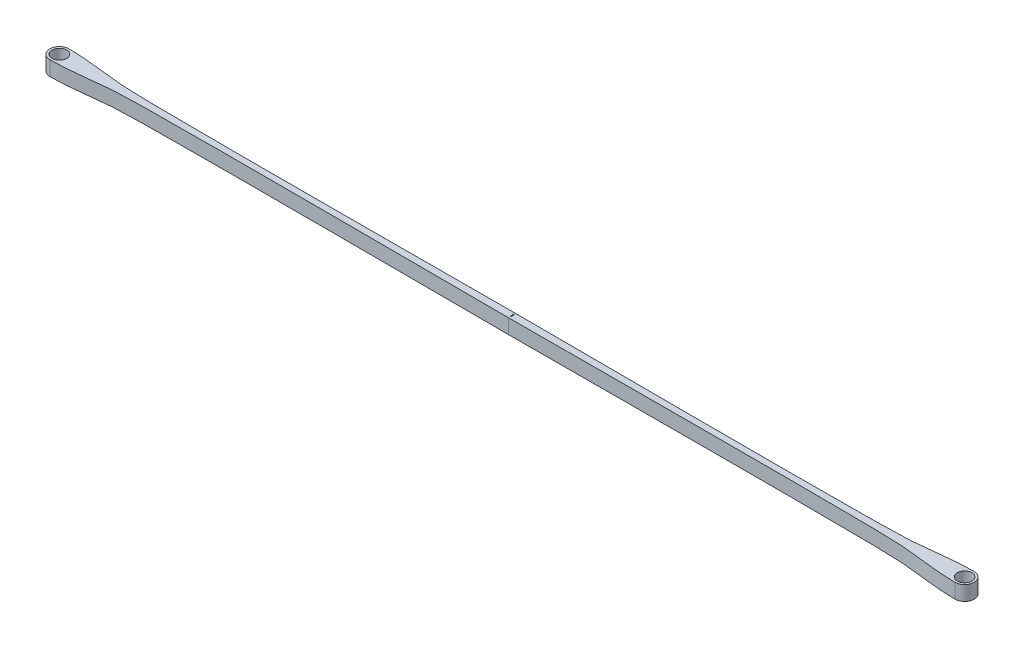
ISO-10303-21;
HEADER;
FILE_DESCRIPTION(('STEP AP214'),'2;1');
FILE_NAME('part.step','',(''),(''),'','','');
FILE_SCHEMA(('AUTOMOTIVE_DESIGN { 1 0 10303 214 1 1 1 1 }'));
ENDSEC;
DATA;
#1=APPLICATION_CONTEXT('core data for automotive mechanical design processes');
#2=APPLICATION_PROTOCOL_DEFINITION('international standard','automotive_design',2000,#1);
#3=PRODUCT_CONTEXT('',#1,'mechanical');
#4=PRODUCT('Part','Part','',(#3));
#5=PRODUCT_RELATED_PRODUCT_CATEGORY('part','',(#4));
#6=PRODUCT_DEFINITION_FORMATION('','',#4);
#7=PRODUCT_DEFINITION_CONTEXT('part definition',#1,'design');
#8=PRODUCT_DEFINITION('design','',#6,#7);
#9=PRODUCT_DEFINITION_SHAPE('','',#8);
#10=(LENGTH_UNIT() NAMED_UNIT(*) SI_UNIT(.MILLI.,.METRE.));
#11=(NAMED_UNIT(*) PLANE_ANGLE_UNIT() SI_UNIT($,.RADIAN.));
#12=(NAMED_UNIT(*) SI_UNIT($,.STERADIAN.) SOLID_ANGLE_UNIT());
#13=UNCERTAINTY_MEASURE_WITH_UNIT(LENGTH_MEASURE(1.E-05),#10,'distance_accuracy_value','');
#14=(GEOMETRIC_REPRESENTATION_CONTEXT(3) GLOBAL_UNCERTAINTY_ASSIGNED_CONTEXT((#13)) GLOBAL_UNIT_ASSIGNED_CONTEXT((#10,
#11,#12)) REPRESENTATION_CONTEXT('',''));
#15=CARTESIAN_POINT('',(0.,0.,0.));
#16=DIRECTION('',(0.,0.,1.));
#17=DIRECTION('',(1.,0.,0.));
#18=AXIS2_PLACEMENT_3D('',#15,#16,#17);
#19=CARTESIAN_POINT('',(0.,2.,1.30000507237961));
#20=CARTESIAN_POINT('',(2.1582956686711,2.,1.30000507237961));
#21=CARTESIAN_POINT('',(7.60592517311194,2.,0.548342251474103));
#22=CARTESIAN_POINT('',(11.061575129074,2.,0.324012224077829));
#23=CARTESIAN_POINT('',(61.9,2.,0.5));
#24=B_SPLINE_CURVE_WITH_KNOTS('',3,(#19,#20,#21,#22,#23),.UNSPECIFIED.,.F.,.F.,(4,1,4),(0.,
0.427834461323006,1.),.UNSPECIFIED.);
#25=DIRECTION('',(0.,-1.,0.));
#26=VECTOR('',#25,1.);
#27=SURFACE_OF_LINEAR_EXTRUSION('',#24,#26);
#28=CARTESIAN_POINT('',(0.,0.,1.30000507237961));
#29=CARTESIAN_POINT('',(2.1582956686711,0.,1.30000507237961));
#30=CARTESIAN_POINT('',(7.60592517311194,0.,0.548342251474103));
#31=CARTESIAN_POINT('',(11.061575129074,0.,0.324012224077829));
#32=CARTESIAN_POINT('',(61.9,0.,0.5));
#33=B_SPLINE_CURVE_WITH_KNOTS('',3,(#28,#29,#30,#31,#32),.UNSPECIFIED.,.F.,.F.,(4,1,4),(0.,
0.427834461323006,1.),.UNSPECIFIED.);
#34=CARTESIAN_POINT('',(0.,0.,1.30000507237961));
#35=VERTEX_POINT('',#34);
#36=CARTESIAN_POINT('',(61.9,0.,0.5));
#37=VERTEX_POINT('',#36);
#38=EDGE_CURVE('E292',#35,#37,#33,.T.);
#39=ORIENTED_EDGE('',*,*,#38,.T.);
#40=DIRECTION('',(0.,-1.,0.));
#41=VECTOR('',#40,1.);
#42=CARTESIAN_POINT('',(61.9,2.,0.5));
#43=LINE('',#42,#41);
#44=CARTESIAN_POINT('',(61.9,2.,0.5));
#45=VERTEX_POINT('',#44);
#46=EDGE_CURVE('E101',#45,#37,#43,.T.);
#47=ORIENTED_EDGE('',*,*,#46,.F.);
#48=CARTESIAN_POINT('',(0.,2.,1.30000507237961));
#49=VERTEX_POINT('',#48);
#50=EDGE_CURVE('E287',#49,#45,#24,.T.);
#51=ORIENTED_EDGE('',*,*,#50,.F.);
#52=DIRECTION('',(0.,-1.,0.));
#53=VECTOR('',#52,1.);
#54=CARTESIAN_POINT('',(0.,2.,1.30000507237961));
#55=LINE('',#54,#53);
#56=EDGE_CURVE('E12',#49,#35,#55,.T.);
#57=ORIENTED_EDGE('',*,*,#56,.T.);
#58=EDGE_LOOP('',(#39,#47,#51,#57));
#59=FACE_BOUND('',#58,.T.);
#60=ADVANCED_FACE('F91',(#59),#27,.F.);
#61=CARTESIAN_POINT('',(0.,2.,-1.30000507237961));
#62=CARTESIAN_POINT('',(2.1582956686711,2.,-1.30000507237961));
#63=CARTESIAN_POINT('',(7.60592517311194,2.,-0.548342251474103));
#64=CARTESIAN_POINT('',(11.061575129074,2.,-0.324012224077829));
#65=CARTESIAN_POINT('',(61.9,2.,-0.5));
#66=B_SPLINE_CURVE_WITH_KNOTS('',3,(#61,#62,#63,#64,#65),.UNSPECIFIED.,.F.,.F.,(4,1,4),(0.,
0.427834461323006,1.),.UNSPECIFIED.);
#67=DIRECTION('',(0.,-1.,0.));
#68=VECTOR('',#67,1.);
#69=SURFACE_OF_LINEAR_EXTRUSION('',#66,#68);
#70=CARTESIAN_POINT('',(0.,0.,-1.30000507237961));
#71=CARTESIAN_POINT('',(2.1582956686711,0.,-1.30000507237961));
#72=CARTESIAN_POINT('',(7.60592517311194,0.,-0.548342251474103));
#73=CARTESIAN_POINT('',(11.061575129074,0.,-0.324012224077829));
#74=CARTESIAN_POINT('',(61.9,0.,-0.5));
#75=B_SPLINE_CURVE_WITH_KNOTS('',3,(#70,#71,#72,#73,#74),.UNSPECIFIED.,.F.,.F.,(4,1,4),(0.,
0.427834461323006,1.),.UNSPECIFIED.);
#76=CARTESIAN_POINT('',(0.,0.,-1.30000507237961));
#77=VERTEX_POINT('',#76);
#78=CARTESIAN_POINT('',(61.9,0.,-0.5));
#79=VERTEX_POINT('',#78);
#80=EDGE_CURVE('E300',#77,#79,#75,.T.);
#81=ORIENTED_EDGE('',*,*,#80,.F.);
#82=DIRECTION('',(0.,-1.,0.));
#83=VECTOR('',#82,1.);
#84=CARTESIAN_POINT('',(0.,2.,-1.30000507237961));
#85=LINE('',#84,#83);
#86=CARTESIAN_POINT('',(0.,2.,-1.30000507237961));
#87=VERTEX_POINT('',#86);
#88=EDGE_CURVE('E118',#87,#77,#85,.T.);
#89=ORIENTED_EDGE('',*,*,#88,.F.);
#90=CARTESIAN_POINT('',(61.9,2.,-0.5));
#91=VERTEX_POINT('',#90);
#92=EDGE_CURVE('E281',#87,#91,#66,.T.);
#93=ORIENTED_EDGE('',*,*,#92,.T.);
#94=DIRECTION('',(0.,-1.,0.));
#95=VECTOR('',#94,1.);
#96=CARTESIAN_POINT('',(61.9,2.,-0.5));
#97=LINE('',#96,#95);
#98=EDGE_CURVE('E315',#91,#79,#97,.T.);
#99=ORIENTED_EDGE('',*,*,#98,.T.);
#100=EDGE_LOOP('',(#81,#89,#93,#99));
#101=FACE_BOUND('',#100,.T.);
#102=ADVANCED_FACE('F276',(#101),#69,.T.);
#103=CARTESIAN_POINT('',(0.,0.,0.));
#104=DIRECTION('',(0.,1.,0.));
#105=DIRECTION('',(0.,0.,1.));
#106=AXIS2_PLACEMENT_3D('',#103,#104,#105);
#107=PLANE('',#106);
#108=CARTESIAN_POINT('',(123.8,0.,0.));
#109=DIRECTION('',(0.,-1.,0.));
#110=DIRECTION('',(0.,0.,1.));
#111=AXIS2_PLACEMENT_3D('',#108,#109,#110);
#112=CIRCLE('',#111,1.);
#113=CARTESIAN_POINT('',(123.8,0.,1.));
#114=VERTEX_POINT('',#113);
#115=EDGE_CURVE('E225',#114,#114,#112,.T.);
#116=ORIENTED_EDGE('',*,*,#115,.F.);
#117=EDGE_LOOP('',(#116));
#118=FACE_BOUND('',#117,.T.);
#119=CARTESIAN_POINT('',(0.,0.,0.));
#120=DIRECTION('',(0.,1.,0.));
#121=DIRECTION('',(0.,0.,1.));
#122=AXIS2_PLACEMENT_3D('',#119,#120,#121);
#123=CIRCLE('',#122,1.);
#124=CARTESIAN_POINT('',(0.,0.,1.));
#125=VERTEX_POINT('',#124);
#126=EDGE_CURVE('E325',#125,#125,#123,.T.);
#127=ORIENTED_EDGE('',*,*,#126,.T.);
#128=EDGE_LOOP('',(#127));
#129=FACE_BOUND('',#128,.T.);
#130=ORIENTED_EDGE('',*,*,#38,.F.);
#131=CARTESIAN_POINT('',(0.,0.,0.));
#132=DIRECTION('',(0.,1.,0.));
#133=DIRECTION('',(0.,0.,1.));
#134=AXIS2_PLACEMENT_3D('',#131,#132,#133);
#135=CIRCLE('',#134,1.30000507237961);
#136=EDGE_CURVE('E95',#77,#35,#135,.T.);
#137=ORIENTED_EDGE('',*,*,#136,.F.);
#138=ORIENTED_EDGE('',*,*,#80,.T.);
#139=CARTESIAN_POINT('',(123.8,0.,-1.30000507237961));
#140=CARTESIAN_POINT('',(121.641704331329,0.,-1.30000507237961));
#141=CARTESIAN_POINT('',(116.194074826888,0.,-0.548342251474103));
#142=CARTESIAN_POINT('',(112.738424870926,0.,-0.324012224077829));
#143=CARTESIAN_POINT('',(61.9,0.,-0.5));
#144=B_SPLINE_CURVE_WITH_KNOTS('',3,(#139,#140,#141,#142,#143),.UNSPECIFIED.,.F.,.F.,(4,1,4),
(0.,0.427834461323006,1.),.UNSPECIFIED.);
#145=CARTESIAN_POINT('',(123.8,0.,-1.30000507237961));
#146=VERTEX_POINT('',#145);
#147=EDGE_CURVE('E237',#146,#79,#144,.T.);
#148=ORIENTED_EDGE('',*,*,#147,.F.);
#149=CARTESIAN_POINT('',(123.8,0.,0.));
#150=DIRECTION('',(0.,-1.,0.));
#151=DIRECTION('',(0.,0.,1.));
#152=AXIS2_PLACEMENT_3D('',#149,#150,#151);
#153=CIRCLE('',#152,1.30000507237961);
#154=CARTESIAN_POINT('',(123.8,0.,1.30000507237961));
#155=VERTEX_POINT('',#154);
#156=EDGE_CURVE('E229',#146,#155,#153,.T.);
#157=ORIENTED_EDGE('',*,*,#156,.T.);
#158=CARTESIAN_POINT('',(123.8,0.,1.30000507237961));
#159=CARTESIAN_POINT('',(121.641704331329,0.,1.30000507237961));
#160=CARTESIAN_POINT('',(116.194074826888,0.,0.548342251474103));
#161=CARTESIAN_POINT('',(112.738424870926,0.,0.324012224077829));
#162=CARTESIAN_POINT('',(61.9,0.,0.5));
#163=B_SPLINE_CURVE_WITH_KNOTS('',3,(#158,#159,#160,#161,#162),.UNSPECIFIED.,.F.,.F.,(4,1,4),
(0.,0.427834461323006,1.),.UNSPECIFIED.);
#164=EDGE_CURVE('E249',#155,#37,#163,.T.);
#165=ORIENTED_EDGE('',*,*,#164,.T.);
#166=EDGE_LOOP('',(#130,#137,#138,#148,#157,#165));
#167=FACE_BOUND('',#166,.T.);
#168=ADVANCED_FACE('F272',(#118,#129,#167),#107,.F.);
#169=CARTESIAN_POINT('',(0.,2.,0.));
#170=DIRECTION('',(0.,1.,0.));
#171=DIRECTION('',(0.,0.,1.));
#172=AXIS2_PLACEMENT_3D('',#169,#170,#171);
#173=PLANE('',#172);
#174=DIRECTION('',(0.,0.,1.));
#175=VECTOR('',#174,1.);
#176=CARTESIAN_POINT('',(61.85,2.,0.200005072379613));
#177=LINE('',#176,#175);
#178=CARTESIAN_POINT('',(61.85,2.,-0.299994927620387));
#179=VERTEX_POINT('',#178);
#180=CARTESIAN_POINT('',(61.85,2.,0.200005072379613));
#181=VERTEX_POINT('',#180);
#182=EDGE_CURVE('E109',#179,#181,#177,.T.);
#183=ORIENTED_EDGE('',*,*,#182,.F.);
#184=DIRECTION('',(-1.,0.,0.));
#185=VECTOR('',#184,1.);
#186=CARTESIAN_POINT('',(61.85,2.,-0.299994927620387));
#187=LINE('',#186,#185);
#188=CARTESIAN_POINT('',(61.95,2.,-0.299994927620387));
#189=VERTEX_POINT('',#188);
#190=EDGE_CURVE('E197',#189,#179,#187,.T.);
#191=ORIENTED_EDGE('',*,*,#190,.F.);
#192=DIRECTION('',(0.,0.,-1.));
#193=VECTOR('',#192,1.);
#194=CARTESIAN_POINT('',(61.95,2.,0.200005072379613));
#195=LINE('',#194,#193);
#196=CARTESIAN_POINT('',(61.95,2.,0.200005072379613));
#197=VERTEX_POINT('',#196);
#198=EDGE_CURVE('E201',#197,#189,#195,.T.);
#199=ORIENTED_EDGE('',*,*,#198,.F.);
#200=DIRECTION('',(1.,0.,0.));
#201=VECTOR('',#200,1.);
#202=CARTESIAN_POINT('',(61.85,2.,0.200005072379613));
#203=LINE('',#202,#201);
#204=EDGE_CURVE('E210',#181,#197,#203,.T.);
#205=ORIENTED_EDGE('',*,*,#204,.F.);
#206=EDGE_LOOP('',(#183,#191,#199,#205));
#207=FACE_BOUND('',#206,.T.);
#208=CARTESIAN_POINT('',(123.8,2.,0.));
#209=DIRECTION('',(0.,-1.,0.));
#210=DIRECTION('',(0.,0.,1.));
#211=AXIS2_PLACEMENT_3D('',#208,#209,#210);
#212=CIRCLE('',#211,1.);
#213=CARTESIAN_POINT('',(123.8,2.,1.));
#214=VERTEX_POINT('',#213);
#215=EDGE_CURVE('E219',#214,#214,#212,.T.);
#216=ORIENTED_EDGE('',*,*,#215,.T.);
#217=EDGE_LOOP('',(#216));
#218=FACE_BOUND('',#217,.T.);
#219=CARTESIAN_POINT('',(0.,2.,0.));
#220=DIRECTION('',(0.,1.,0.));
#221=DIRECTION('',(0.,0.,1.));
#222=AXIS2_PLACEMENT_3D('',#219,#220,#221);
#223=CIRCLE('',#222,1.);
#224=CARTESIAN_POINT('',(0.,2.,1.));
#225=VERTEX_POINT('',#224);
#226=EDGE_CURVE('E329',#225,#225,#223,.T.);
#227=ORIENTED_EDGE('',*,*,#226,.F.);
#228=EDGE_LOOP('',(#227));
#229=FACE_BOUND('',#228,.T.);
#230=ORIENTED_EDGE('',*,*,#92,.F.);
#231=CARTESIAN_POINT('',(0.,2.,0.));
#232=DIRECTION('',(0.,1.,0.));
#233=DIRECTION('',(0.,0.,1.));
#234=AXIS2_PLACEMENT_3D('',#231,#232,#233);
#235=CIRCLE('',#234,1.30000507237961);
#236=EDGE_CURVE('E301',#87,#49,#235,.T.);
#237=ORIENTED_EDGE('',*,*,#236,.T.);
#238=ORIENTED_EDGE('',*,*,#50,.T.);
#239=CARTESIAN_POINT('',(123.8,2.,1.30000507237961));
#240=CARTESIAN_POINT('',(121.641704331329,2.,1.30000507237961));
#241=CARTESIAN_POINT('',(116.194074826888,2.,0.548342251474103));
#242=CARTESIAN_POINT('',(112.738424870926,2.,0.324012224077829));
#243=CARTESIAN_POINT('',(61.9,2.,0.5));
#244=B_SPLINE_CURVE_WITH_KNOTS('',3,(#239,#240,#241,#242,#243),.UNSPECIFIED.,.F.,.F.,(4,1,4),
(0.,0.427834461323006,1.),.UNSPECIFIED.);
#245=CARTESIAN_POINT('',(123.8,2.,1.30000507237961));
#246=VERTEX_POINT('',#245);
#247=EDGE_CURVE('E248',#246,#45,#244,.T.);
#248=ORIENTED_EDGE('',*,*,#247,.F.);
#249=CARTESIAN_POINT('',(123.8,2.,0.));
#250=DIRECTION('',(0.,-1.,0.));
#251=DIRECTION('',(0.,0.,1.));
#252=AXIS2_PLACEMENT_3D('',#249,#250,#251);
#253=CIRCLE('',#252,1.30000507237961);
#254=CARTESIAN_POINT('',(123.8,2.,-1.30000507237961));
#255=VERTEX_POINT('',#254);
#256=EDGE_CURVE('E233',#255,#246,#253,.T.);
#257=ORIENTED_EDGE('',*,*,#256,.F.);
#258=CARTESIAN_POINT('',(123.8,2.,-1.30000507237961));
#259=CARTESIAN_POINT('',(121.641704331329,2.,-1.30000507237961));
#260=CARTESIAN_POINT('',(116.194074826888,2.,-0.548342251474103));
#261=CARTESIAN_POINT('',(112.738424870926,2.,-0.324012224077829));
#262=CARTESIAN_POINT('',(61.9,2.,-0.5));
#263=B_SPLINE_CURVE_WITH_KNOTS('',3,(#258,#259,#260,#261,#262),.UNSPECIFIED.,.F.,.F.,(4,1,4),
(0.,0.427834461323006,1.),.UNSPECIFIED.);
#264=EDGE_CURVE('E241',#255,#91,#263,.T.);
#265=ORIENTED_EDGE('',*,*,#264,.T.);
#266=EDGE_LOOP('',(#230,#237,#238,#248,#257,#265));
#267=FACE_BOUND('',#266,.T.);
#268=ADVANCED_FACE('F269',(#207,#218,#229,#267),#173,.T.);
#269=CARTESIAN_POINT('',(0.,2.,0.));
#270=DIRECTION('',(0.,-1.,0.));
#271=DIRECTION('',(0.,0.,-1.));
#272=AXIS2_PLACEMENT_3D('',#269,#270,#271);
#273=CYLINDRICAL_SURFACE('',#272,1.30000507237961);
#274=ORIENTED_EDGE('',*,*,#56,.F.);
#275=ORIENTED_EDGE('',*,*,#236,.F.);
#276=ORIENTED_EDGE('',*,*,#88,.T.);
#277=ORIENTED_EDGE('',*,*,#136,.T.);
#278=EDGE_LOOP('',(#274,#275,#276,#277));
#279=FACE_BOUND('',#278,.T.);
#280=ADVANCED_FACE('F93',(#279),#273,.T.);
#281=CARTESIAN_POINT('',(0.,0.,0.));
#282=DIRECTION('',(0.,1.,0.));
#283=DIRECTION('',(0.,0.,1.));
#284=AXIS2_PLACEMENT_3D('',#281,#282,#283);
#285=CYLINDRICAL_SURFACE('',#284,1.);
#286=ORIENTED_EDGE('',*,*,#126,.F.);
#287=EDGE_LOOP('',(#286));
#288=FACE_BOUND('',#287,.T.);
#289=ORIENTED_EDGE('',*,*,#226,.T.);
#290=EDGE_LOOP('',(#289));
#291=FACE_BOUND('',#290,.T.);
#292=ADVANCED_FACE('F263',(#288,#291),#285,.F.);
#293=DIRECTION('',(0.,-1.,0.));
#294=VECTOR('',#293,1.);
#295=SURFACE_OF_LINEAR_EXTRUSION('',#263,#294);
#296=ORIENTED_EDGE('',*,*,#147,.T.);
#297=ORIENTED_EDGE('',*,*,#98,.F.);
#298=ORIENTED_EDGE('',*,*,#264,.F.);
#299=DIRECTION('',(0.,-1.,0.));
#300=VECTOR('',#299,1.);
#301=CARTESIAN_POINT('',(123.8,2.,-1.30000507237961));
#302=LINE('',#301,#300);
#303=EDGE_CURVE('E335',#255,#146,#302,.T.);
#304=ORIENTED_EDGE('',*,*,#303,.T.);
#305=EDGE_LOOP('',(#296,#297,#298,#304));
#306=FACE_BOUND('',#305,.T.);
#307=ADVANCED_FACE('F258',(#306),#295,.F.);
#308=DIRECTION('',(0.,-1.,0.));
#309=VECTOR('',#308,1.);
#310=SURFACE_OF_LINEAR_EXTRUSION('',#244,#309);
#311=ORIENTED_EDGE('',*,*,#164,.F.);
#312=DIRECTION('',(0.,-1.,0.));
#313=VECTOR('',#312,1.);
#314=CARTESIAN_POINT('',(123.8,2.,1.30000507237961));
#315=LINE('',#314,#313);
#316=EDGE_CURVE('E339',#246,#155,#315,.T.);
#317=ORIENTED_EDGE('',*,*,#316,.F.);
#318=ORIENTED_EDGE('',*,*,#247,.T.);
#319=ORIENTED_EDGE('',*,*,#46,.T.);
#320=EDGE_LOOP('',(#311,#317,#318,#319));
#321=FACE_BOUND('',#320,.T.);
#322=ADVANCED_FACE('F262',(#321),#310,.T.);
#323=CARTESIAN_POINT('',(123.8,2.,0.));
#324=DIRECTION('',(0.,-1.,0.));
#325=DIRECTION('',(0.,0.,-1.));
#326=AXIS2_PLACEMENT_3D('',#323,#324,#325);
#327=CYLINDRICAL_SURFACE('',#326,1.30000507237961);
#328=ORIENTED_EDGE('',*,*,#303,.F.);
#329=ORIENTED_EDGE('',*,*,#256,.T.);
#330=ORIENTED_EDGE('',*,*,#316,.T.);
#331=ORIENTED_EDGE('',*,*,#156,.F.);
#332=EDGE_LOOP('',(#328,#329,#330,#331));
#333=FACE_BOUND('',#332,.T.);
#334=ADVANCED_FACE('F363',(#333),#327,.T.);
#335=CARTESIAN_POINT('',(123.8,0.,0.));
#336=DIRECTION('',(0.,1.,0.));
#337=DIRECTION('',(0.,0.,1.));
#338=AXIS2_PLACEMENT_3D('',#335,#336,#337);
#339=CYLINDRICAL_SURFACE('',#338,1.);
#340=ORIENTED_EDGE('',*,*,#115,.T.);
#341=EDGE_LOOP('',(#340));
#342=FACE_BOUND('',#341,.T.);
#343=ORIENTED_EDGE('',*,*,#215,.F.);
#344=EDGE_LOOP('',(#343));
#345=FACE_BOUND('',#344,.T.);
#346=ADVANCED_FACE('F413',(#342,#345),#339,.F.);
#347=CARTESIAN_POINT('',(61.85,1.5,0.200005072379613));
#348=DIRECTION('',(-1.,0.,0.));
#349=DIRECTION('',(0.,0.,1.));
#350=AXIS2_PLACEMENT_3D('',#347,#348,#349);
#351=PLANE('',#350);
#352=ORIENTED_EDGE('',*,*,#182,.T.);
#353=DIRECTION('',(0.,1.,0.));
#354=VECTOR('',#353,1.);
#355=CARTESIAN_POINT('',(61.85,1.5,0.200005072379613));
#356=LINE('',#355,#354);
#357=CARTESIAN_POINT('',(61.85,1.5,0.200005072379613));
#358=VERTEX_POINT('',#357);
#359=EDGE_CURVE('E172',#358,#181,#356,.T.);
#360=ORIENTED_EDGE('',*,*,#359,.F.);
#361=DIRECTION('',(0.,0.,1.));
#362=VECTOR('',#361,1.);
#363=CARTESIAN_POINT('',(61.85,1.5,0.200005072379613));
#364=LINE('',#363,#362);
#365=CARTESIAN_POINT('',(61.85,1.5,-0.299994927620387));
#366=VERTEX_POINT('',#365);
#367=EDGE_CURVE('E176',#366,#358,#364,.T.);
#368=ORIENTED_EDGE('',*,*,#367,.F.);
#369=DIRECTION('',(0.,1.,0.));
#370=VECTOR('',#369,1.);
#371=CARTESIAN_POINT('',(61.85,1.5,-0.299994927620387));
#372=LINE('',#371,#370);
#373=EDGE_CURVE('E216',#366,#179,#372,.T.);
#374=ORIENTED_EDGE('',*,*,#373,.T.);
#375=EDGE_LOOP('',(#352,#360,#368,#374));
#376=FACE_BOUND('',#375,.T.);
#377=ADVANCED_FACE('F174',(#376),#351,.F.);
#378=CARTESIAN_POINT('',(61.85,1.5,-0.299994927620387));
#379=DIRECTION('',(0.,0.,-1.));
#380=DIRECTION('',(-1.,0.,0.));
#381=AXIS2_PLACEMENT_3D('',#378,#379,#380);
#382=PLANE('',#381);
#383=ORIENTED_EDGE('',*,*,#190,.T.);
#384=ORIENTED_EDGE('',*,*,#373,.F.);
#385=DIRECTION('',(-1.,0.,0.));
#386=VECTOR('',#385,1.);
#387=CARTESIAN_POINT('',(61.85,1.5,-0.299994927620387));
#388=LINE('',#387,#386);
#389=CARTESIAN_POINT('',(61.95,1.5,-0.299994927620387));
#390=VERTEX_POINT('',#389);
#391=EDGE_CURVE('E183',#390,#366,#388,.T.);
#392=ORIENTED_EDGE('',*,*,#391,.F.);
#393=DIRECTION('',(0.,1.,0.));
#394=VECTOR('',#393,1.);
#395=CARTESIAN_POINT('',(61.95,1.5,-0.299994927620387));
#396=LINE('',#395,#394);
#397=EDGE_CURVE('E220',#390,#189,#396,.T.);
#398=ORIENTED_EDGE('',*,*,#397,.T.);
#399=EDGE_LOOP('',(#383,#384,#392,#398));
#400=FACE_BOUND('',#399,.T.);
#401=ADVANCED_FACE('F424',(#400),#382,.F.);
#402=CARTESIAN_POINT('',(61.95,1.5,0.200005072379613));
#403=DIRECTION('',(1.,0.,0.));
#404=DIRECTION('',(0.,0.,-1.));
#405=AXIS2_PLACEMENT_3D('',#402,#403,#404);
#406=PLANE('',#405);
#407=ORIENTED_EDGE('',*,*,#198,.T.);
#408=ORIENTED_EDGE('',*,*,#397,.F.);
#409=DIRECTION('',(0.,0.,-1.));
#410=VECTOR('',#409,1.);
#411=CARTESIAN_POINT('',(61.95,1.5,0.200005072379613));
#412=LINE('',#411,#410);
#413=CARTESIAN_POINT('',(61.95,1.5,0.200005072379613));
#414=VERTEX_POINT('',#413);
#415=EDGE_CURVE('E192',#414,#390,#412,.T.);
#416=ORIENTED_EDGE('',*,*,#415,.F.);
#417=DIRECTION('',(0.,1.,0.));
#418=VECTOR('',#417,1.);
#419=CARTESIAN_POINT('',(61.95,1.5,0.200005072379613));
#420=LINE('',#419,#418);
#421=EDGE_CURVE('E182',#414,#197,#420,.T.);
#422=ORIENTED_EDGE('',*,*,#421,.T.);
#423=EDGE_LOOP('',(#407,#408,#416,#422));
#424=FACE_BOUND('',#423,.T.);
#425=ADVANCED_FACE('F431',(#424),#406,.F.);
#426=CARTESIAN_POINT('',(61.85,1.5,0.200005072379613));
#427=DIRECTION('',(0.,0.,1.));
#428=DIRECTION('',(1.,0.,0.));
#429=AXIS2_PLACEMENT_3D('',#426,#427,#428);
#430=PLANE('',#429);
#431=ORIENTED_EDGE('',*,*,#204,.T.);
#432=ORIENTED_EDGE('',*,*,#421,.F.);
#433=DIRECTION('',(1.,0.,0.));
#434=VECTOR('',#433,1.);
#435=CARTESIAN_POINT('',(61.85,1.5,0.200005072379613));
#436=LINE('',#435,#434);
#437=EDGE_CURVE('E186',#358,#414,#436,.T.);
#438=ORIENTED_EDGE('',*,*,#437,.F.);
#439=ORIENTED_EDGE('',*,*,#359,.T.);
#440=EDGE_LOOP('',(#431,#432,#438,#439));
#441=FACE_BOUND('',#440,.T.);
#442=ADVANCED_FACE('F187',(#441),#430,.F.);
#443=CARTESIAN_POINT('',(0.,1.5,0.));
#444=DIRECTION('',(0.,-1.,0.));
#445=DIRECTION('',(0.,0.,-1.));
#446=AXIS2_PLACEMENT_3D('',#443,#444,#445);
#447=PLANE('',#446);
#448=ORIENTED_EDGE('',*,*,#367,.T.);
#449=ORIENTED_EDGE('',*,*,#437,.T.);
#450=ORIENTED_EDGE('',*,*,#415,.T.);
#451=ORIENTED_EDGE('',*,*,#391,.T.);
#452=EDGE_LOOP('',(#448,#449,#450,#451));
#453=FACE_BOUND('',#452,.T.);
#454=ADVANCED_FACE('F194',(#453),#447,.F.);
#455=CLOSED_SHELL('',(#60,#102,#168,#268,#280,#292,#307,#322,#334,#346,#377,#401,#425,#442,#454));
#456=MANIFOLD_SOLID_BREP('B2',#455);
#457=ADVANCED_BREP_SHAPE_REPRESENTATION('',(#18,#456),#14);
#458=SHAPE_DEFINITION_REPRESENTATION(#9,#457);
ENDSEC;
END-ISO-10303-21;
